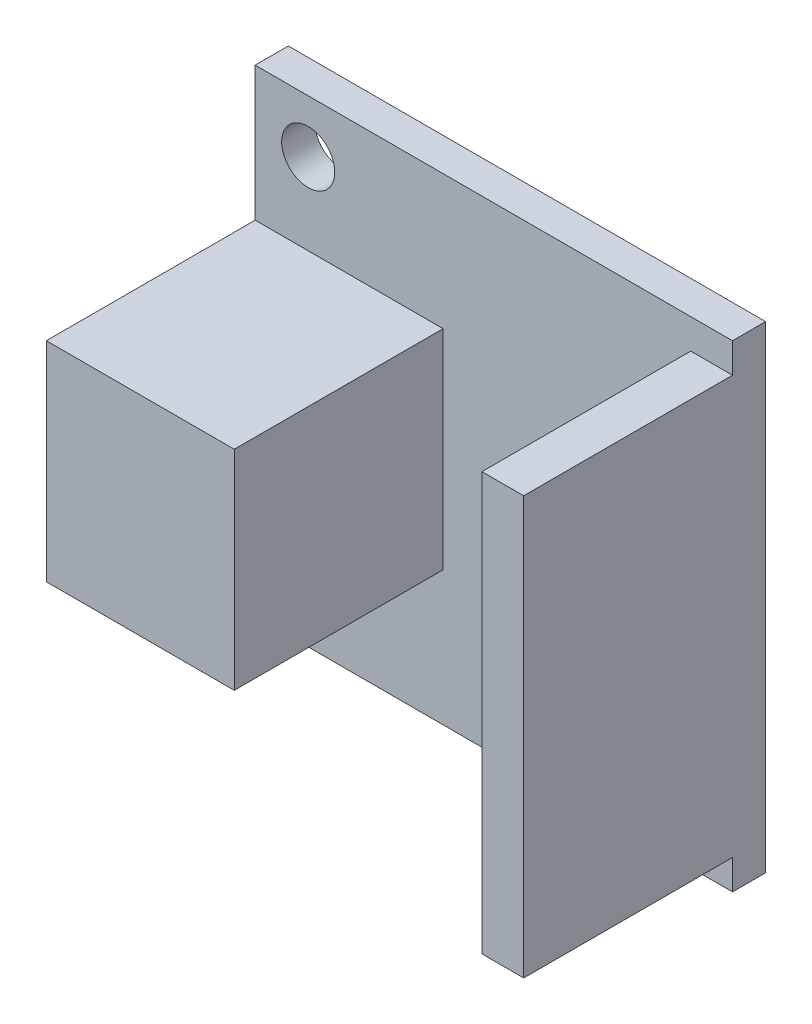
ISO-10303-21;
HEADER;
FILE_DESCRIPTION(('STEP AP214'),'2;1');
FILE_NAME('part.step','',(''),(''),'','','');
FILE_SCHEMA(('AUTOMOTIVE_DESIGN { 1 0 10303 214 1 1 1 1 }'));
ENDSEC;
DATA;
#1=APPLICATION_CONTEXT('core data for automotive mechanical design processes');
#2=APPLICATION_PROTOCOL_DEFINITION('international standard','automotive_design',2000,#1);
#3=PRODUCT_CONTEXT('',#1,'mechanical');
#4=PRODUCT('Part','Part','',(#3));
#5=PRODUCT_RELATED_PRODUCT_CATEGORY('part','',(#4));
#6=PRODUCT_DEFINITION_FORMATION('','',#4);
#7=PRODUCT_DEFINITION_CONTEXT('part definition',#1,'design');
#8=PRODUCT_DEFINITION('design','',#6,#7);
#9=PRODUCT_DEFINITION_SHAPE('','',#8);
#10=(LENGTH_UNIT() NAMED_UNIT(*) SI_UNIT(.MILLI.,.METRE.));
#11=(NAMED_UNIT(*) PLANE_ANGLE_UNIT() SI_UNIT($,.RADIAN.));
#12=(NAMED_UNIT(*) SI_UNIT($,.STERADIAN.) SOLID_ANGLE_UNIT());
#13=UNCERTAINTY_MEASURE_WITH_UNIT(LENGTH_MEASURE(1.E-05),#10,'distance_accuracy_value','');
#14=(GEOMETRIC_REPRESENTATION_CONTEXT(3) GLOBAL_UNCERTAINTY_ASSIGNED_CONTEXT((#13)) GLOBAL_UNIT_ASSIGNED_CONTEXT((#10,
#11,#12)) REPRESENTATION_CONTEXT('',''));
#15=CARTESIAN_POINT('',(0.,0.,0.));
#16=DIRECTION('',(0.,0.,1.));
#17=DIRECTION('',(1.,0.,0.));
#18=AXIS2_PLACEMENT_3D('',#15,#16,#17);
#19=CARTESIAN_POINT('',(0.,0.,1.5875));
#20=DIRECTION('',(0.,0.,1.));
#21=DIRECTION('',(1.,0.,0.));
#22=AXIS2_PLACEMENT_3D('',#19,#20,#21);
#23=PLANE('',#22);
#24=CARTESIAN_POINT('',(-8.89,8.89,1.5875));
#25=DIRECTION('',(0.,0.,1.));
#26=DIRECTION('',(1.,0.,0.));
#27=AXIS2_PLACEMENT_3D('',#24,#25,#26);
#28=CIRCLE('',#27,1.27);
#29=CARTESIAN_POINT('',(-7.62,8.89,1.5875));
#30=VERTEX_POINT('',#29);
#31=EDGE_CURVE('E416',#30,#30,#28,.T.);
#32=ORIENTED_EDGE('',*,*,#31,.F.);
#33=EDGE_LOOP('',(#32));
#34=FACE_BOUND('',#33,.T.);
#35=CARTESIAN_POINT('',(-8.89,-8.89,1.5875));
#36=DIRECTION('',(0.,0.,1.));
#37=DIRECTION('',(1.,0.,0.));
#38=AXIS2_PLACEMENT_3D('',#35,#36,#37);
#39=CIRCLE('',#38,1.27);
#40=CARTESIAN_POINT('',(-7.62,-8.89,1.5875));
#41=VERTEX_POINT('',#40);
#42=EDGE_CURVE('E424',#41,#41,#39,.T.);
#43=ORIENTED_EDGE('',*,*,#42,.F.);
#44=EDGE_LOOP('',(#43));
#45=FACE_BOUND('',#44,.T.);
#46=DIRECTION('',(0.,-1.,0.));
#47=VECTOR('',#46,1.);
#48=CARTESIAN_POINT('',(9.43,10.,1.5875));
#49=LINE('',#48,#47);
#50=CARTESIAN_POINT('',(9.43,10.,1.5875));
#51=VERTEX_POINT('',#50);
#52=CARTESIAN_POINT('',(9.43000000000001,-10.,1.5875));
#53=VERTEX_POINT('',#52);
#54=EDGE_CURVE('E436',#51,#53,#49,.T.);
#55=ORIENTED_EDGE('',*,*,#54,.F.);
#56=DIRECTION('',(-1.,0.,0.));
#57=VECTOR('',#56,1.);
#58=CARTESIAN_POINT('',(9.43,10.,1.5875));
#59=LINE('',#58,#57);
#60=CARTESIAN_POINT('',(11.43,10.,1.5875));
#61=VERTEX_POINT('',#60);
#62=EDGE_CURVE('E258',#61,#51,#59,.T.);
#63=ORIENTED_EDGE('',*,*,#62,.F.);
#64=DIRECTION('',(0.,1.,0.));
#65=VECTOR('',#64,1.);
#66=CARTESIAN_POINT('',(11.43,11.43,1.5875));
#67=LINE('',#66,#65);
#68=CARTESIAN_POINT('',(11.43,11.43,1.5875));
#69=VERTEX_POINT('',#68);
#70=EDGE_CURVE('E154',#61,#69,#67,.T.);
#71=ORIENTED_EDGE('',*,*,#70,.T.);
#72=DIRECTION('',(-1.,0.,0.));
#73=VECTOR('',#72,1.);
#74=CARTESIAN_POINT('',(-11.43,11.43,1.5875));
#75=LINE('',#74,#73);
#76=CARTESIAN_POINT('',(-11.43,11.43,1.5875));
#77=VERTEX_POINT('',#76);
#78=EDGE_CURVE('E204',#69,#77,#75,.T.);
#79=ORIENTED_EDGE('',*,*,#78,.T.);
#80=DIRECTION('',(0.,-1.,0.));
#81=VECTOR('',#80,1.);
#82=CARTESIAN_POINT('',(-11.43,11.43,1.5875));
#83=LINE('',#82,#81);
#84=CARTESIAN_POINT('',(-11.43,5.,1.5875));
#85=VERTEX_POINT('',#84);
#86=EDGE_CURVE('E208',#77,#85,#83,.T.);
#87=ORIENTED_EDGE('',*,*,#86,.T.);
#88=DIRECTION('',(-1.,0.,0.));
#89=VECTOR('',#88,1.);
#90=CARTESIAN_POINT('',(-11.43,5.,1.5875));
#91=LINE('',#90,#89);
#92=CARTESIAN_POINT('',(-2.43,5.,1.5875));
#93=VERTEX_POINT('',#92);
#94=EDGE_CURVE('E159',#93,#85,#91,.T.);
#95=ORIENTED_EDGE('',*,*,#94,.F.);
#96=DIRECTION('',(0.,1.,0.));
#97=VECTOR('',#96,1.);
#98=CARTESIAN_POINT('',(-2.43,5.,1.5875));
#99=LINE('',#98,#97);
#100=CARTESIAN_POINT('',(-2.43,-5.,1.5875));
#101=VERTEX_POINT('',#100);
#102=EDGE_CURVE('E62',#101,#93,#99,.T.);
#103=ORIENTED_EDGE('',*,*,#102,.F.);
#104=DIRECTION('',(1.,0.,0.));
#105=VECTOR('',#104,1.);
#106=CARTESIAN_POINT('',(-11.43,-5.,1.5875));
#107=LINE('',#106,#105);
#108=CARTESIAN_POINT('',(-11.43,-5.,1.5875));
#109=VERTEX_POINT('',#108);
#110=EDGE_CURVE('E169',#109,#101,#107,.T.);
#111=ORIENTED_EDGE('',*,*,#110,.F.);
#112=CARTESIAN_POINT('',(-11.43,-11.43,1.5875));
#113=VERTEX_POINT('',#112);
#114=EDGE_CURVE('E207',#109,#113,#83,.T.);
#115=ORIENTED_EDGE('',*,*,#114,.T.);
#116=DIRECTION('',(1.,0.,0.));
#117=VECTOR('',#116,1.);
#118=CARTESIAN_POINT('',(-11.43,-11.43,1.5875));
#119=LINE('',#118,#117);
#120=CARTESIAN_POINT('',(11.43,-11.43,1.5875));
#121=VERTEX_POINT('',#120);
#122=EDGE_CURVE('E211',#113,#121,#119,.T.);
#123=ORIENTED_EDGE('',*,*,#122,.T.);
#124=CARTESIAN_POINT('',(11.43,-10.,1.5875));
#125=VERTEX_POINT('',#124);
#126=EDGE_CURVE('E200',#121,#125,#67,.T.);
#127=ORIENTED_EDGE('',*,*,#126,.T.);
#128=DIRECTION('',(1.,0.,0.));
#129=VECTOR('',#128,1.);
#130=CARTESIAN_POINT('',(9.43000000000001,-10.,1.5875));
#131=LINE('',#130,#129);
#132=EDGE_CURVE('E149',#53,#125,#131,.T.);
#133=ORIENTED_EDGE('',*,*,#132,.F.);
#134=EDGE_LOOP('',(#55,#63,#71,#79,#87,#95,#103,#111,#115,#123,#127,#133));
#135=FACE_BOUND('',#134,.T.);
#136=ADVANCED_FACE('F38',(#34,#45,#135),#23,.T.);
#137=CARTESIAN_POINT('',(11.43,11.43,1.5875));
#138=DIRECTION('',(-1.,0.,0.));
#139=DIRECTION('',(0.,-1.,0.));
#140=AXIS2_PLACEMENT_3D('',#137,#138,#139);
#141=PLANE('',#140);
#142=DIRECTION('',(0.,1.,0.));
#143=VECTOR('',#142,1.);
#144=CARTESIAN_POINT('',(11.43,11.43,0.));
#145=LINE('',#144,#143);
#146=CARTESIAN_POINT('',(11.43,-11.43,0.));
#147=VERTEX_POINT('',#146);
#148=CARTESIAN_POINT('',(11.43,11.43,0.));
#149=VERTEX_POINT('',#148);
#150=EDGE_CURVE('E199',#147,#149,#145,.T.);
#151=ORIENTED_EDGE('',*,*,#150,.T.);
#152=DIRECTION('',(0.,0.,-1.));
#153=VECTOR('',#152,1.);
#154=CARTESIAN_POINT('',(11.43,11.43,1.5875));
#155=LINE('',#154,#153);
#156=EDGE_CURVE('E11',#69,#149,#155,.T.);
#157=ORIENTED_EDGE('',*,*,#156,.F.);
#158=ORIENTED_EDGE('',*,*,#70,.F.);
#159=DIRECTION('',(0.,0.,-1.));
#160=VECTOR('',#159,1.);
#161=CARTESIAN_POINT('',(11.43,10.,11.5875));
#162=LINE('',#161,#160);
#163=CARTESIAN_POINT('',(11.43,10.,11.5875));
#164=VERTEX_POINT('',#163);
#165=EDGE_CURVE('E132',#164,#61,#162,.T.);
#166=ORIENTED_EDGE('',*,*,#165,.F.);
#167=DIRECTION('',(0.,1.,0.));
#168=VECTOR('',#167,1.);
#169=CARTESIAN_POINT('',(11.43,10.,11.5875));
#170=LINE('',#169,#168);
#171=CARTESIAN_POINT('',(11.43,-10.,11.5875));
#172=VERTEX_POINT('',#171);
#173=EDGE_CURVE('E140',#172,#164,#170,.T.);
#174=ORIENTED_EDGE('',*,*,#173,.F.);
#175=DIRECTION('',(0.,0.,-1.));
#176=VECTOR('',#175,1.);
#177=CARTESIAN_POINT('',(11.43,-10.,11.5875));
#178=LINE('',#177,#176);
#179=EDGE_CURVE('E251',#172,#125,#178,.T.);
#180=ORIENTED_EDGE('',*,*,#179,.T.);
#181=ORIENTED_EDGE('',*,*,#126,.F.);
#182=DIRECTION('',(0.,0.,-1.));
#183=VECTOR('',#182,1.);
#184=CARTESIAN_POINT('',(11.43,-11.43,1.5875));
#185=LINE('',#184,#183);
#186=EDGE_CURVE('E214',#121,#147,#185,.T.);
#187=ORIENTED_EDGE('',*,*,#186,.T.);
#188=EDGE_LOOP('',(#151,#157,#158,#166,#174,#180,#181,#187));
#189=FACE_BOUND('',#188,.T.);
#190=ADVANCED_FACE('F40',(#189),#141,.F.);
#191=CARTESIAN_POINT('',(-11.43,11.43,1.5875));
#192=DIRECTION('',(0.,-1.,0.));
#193=DIRECTION('',(0.,0.,-1.));
#194=AXIS2_PLACEMENT_3D('',#191,#192,#193);
#195=PLANE('',#194);
#196=DIRECTION('',(-1.,0.,0.));
#197=VECTOR('',#196,1.);
#198=CARTESIAN_POINT('',(-11.43,11.43,0.));
#199=LINE('',#198,#197);
#200=CARTESIAN_POINT('',(-11.43,11.43,0.));
#201=VERTEX_POINT('',#200);
#202=EDGE_CURVE('E217',#149,#201,#199,.T.);
#203=ORIENTED_EDGE('',*,*,#202,.T.);
#204=DIRECTION('',(0.,0.,-1.));
#205=VECTOR('',#204,1.);
#206=CARTESIAN_POINT('',(-11.43,11.43,1.5875));
#207=LINE('',#206,#205);
#208=EDGE_CURVE('E47',#77,#201,#207,.T.);
#209=ORIENTED_EDGE('',*,*,#208,.F.);
#210=ORIENTED_EDGE('',*,*,#78,.F.);
#211=ORIENTED_EDGE('',*,*,#156,.T.);
#212=EDGE_LOOP('',(#203,#209,#210,#211));
#213=FACE_BOUND('',#212,.T.);
#214=ADVANCED_FACE('F259',(#213),#195,.F.);
#215=CARTESIAN_POINT('',(-11.43,11.43,1.5875));
#216=DIRECTION('',(1.,0.,0.));
#217=DIRECTION('',(0.,1.,0.));
#218=AXIS2_PLACEMENT_3D('',#215,#216,#217);
#219=PLANE('',#218);
#220=DIRECTION('',(0.,-1.,0.));
#221=VECTOR('',#220,1.);
#222=CARTESIAN_POINT('',(-11.43,11.43,0.));
#223=LINE('',#222,#221);
#224=CARTESIAN_POINT('',(-11.43,-11.43,0.));
#225=VERTEX_POINT('',#224);
#226=EDGE_CURVE('E220',#201,#225,#223,.T.);
#227=ORIENTED_EDGE('',*,*,#226,.T.);
#228=DIRECTION('',(0.,0.,-1.));
#229=VECTOR('',#228,1.);
#230=CARTESIAN_POINT('',(-11.43,-11.43,1.5875));
#231=LINE('',#230,#229);
#232=EDGE_CURVE('E229',#113,#225,#231,.T.);
#233=ORIENTED_EDGE('',*,*,#232,.F.);
#234=ORIENTED_EDGE('',*,*,#114,.F.);
#235=DIRECTION('',(0.,0.,-1.));
#236=VECTOR('',#235,1.);
#237=CARTESIAN_POINT('',(-11.43,-5.,11.5875));
#238=LINE('',#237,#236);
#239=CARTESIAN_POINT('',(-11.43,-5.,11.5875));
#240=VERTEX_POINT('',#239);
#241=EDGE_CURVE('E187',#240,#109,#238,.T.);
#242=ORIENTED_EDGE('',*,*,#241,.F.);
#243=DIRECTION('',(0.,-1.,0.));
#244=VECTOR('',#243,1.);
#245=CARTESIAN_POINT('',(-11.43,5.,11.5875));
#246=LINE('',#245,#244);
#247=CARTESIAN_POINT('',(-11.43,5.,11.5875));
#248=VERTEX_POINT('',#247);
#249=EDGE_CURVE('E172',#248,#240,#246,.T.);
#250=ORIENTED_EDGE('',*,*,#249,.F.);
#251=DIRECTION('',(0.,0.,-1.));
#252=VECTOR('',#251,1.);
#253=CARTESIAN_POINT('',(-11.43,5.,11.5875));
#254=LINE('',#253,#252);
#255=EDGE_CURVE('E191',#248,#85,#254,.T.);
#256=ORIENTED_EDGE('',*,*,#255,.T.);
#257=ORIENTED_EDGE('',*,*,#86,.F.);
#258=ORIENTED_EDGE('',*,*,#208,.T.);
#259=EDGE_LOOP('',(#227,#233,#234,#242,#250,#256,#257,#258));
#260=FACE_BOUND('',#259,.T.);
#261=ADVANCED_FACE('F238',(#260),#219,.F.);
#262=CARTESIAN_POINT('',(-11.43,-11.43,1.5875));
#263=DIRECTION('',(0.,1.,0.));
#264=DIRECTION('',(0.,0.,1.));
#265=AXIS2_PLACEMENT_3D('',#262,#263,#264);
#266=PLANE('',#265);
#267=DIRECTION('',(1.,0.,0.));
#268=VECTOR('',#267,1.);
#269=CARTESIAN_POINT('',(-11.43,-11.43,0.));
#270=LINE('',#269,#268);
#271=EDGE_CURVE('E223',#225,#147,#270,.T.);
#272=ORIENTED_EDGE('',*,*,#271,.T.);
#273=ORIENTED_EDGE('',*,*,#186,.F.);
#274=ORIENTED_EDGE('',*,*,#122,.F.);
#275=ORIENTED_EDGE('',*,*,#232,.T.);
#276=EDGE_LOOP('',(#272,#273,#274,#275));
#277=FACE_BOUND('',#276,.T.);
#278=ADVANCED_FACE('F248',(#277),#266,.F.);
#279=CARTESIAN_POINT('',(0.,0.,0.));
#280=DIRECTION('',(0.,0.,1.));
#281=DIRECTION('',(1.,0.,0.));
#282=AXIS2_PLACEMENT_3D('',#279,#280,#281);
#283=PLANE('',#282);
#284=CARTESIAN_POINT('',(-8.89,8.89,0.));
#285=DIRECTION('',(0.,0.,1.));
#286=DIRECTION('',(1.,0.,0.));
#287=AXIS2_PLACEMENT_3D('',#284,#285,#286);
#288=CIRCLE('',#287,1.27);
#289=CARTESIAN_POINT('',(-7.62,8.89,0.));
#290=VERTEX_POINT('',#289);
#291=EDGE_CURVE('E414',#290,#290,#288,.T.);
#292=ORIENTED_EDGE('',*,*,#291,.T.);
#293=EDGE_LOOP('',(#292));
#294=FACE_BOUND('',#293,.T.);
#295=CARTESIAN_POINT('',(-8.89,-8.89,0.));
#296=DIRECTION('',(0.,0.,1.));
#297=DIRECTION('',(1.,0.,0.));
#298=AXIS2_PLACEMENT_3D('',#295,#296,#297);
#299=CIRCLE('',#298,1.27);
#300=CARTESIAN_POINT('',(-7.62,-8.89,0.));
#301=VERTEX_POINT('',#300);
#302=EDGE_CURVE('E418',#301,#301,#299,.T.);
#303=ORIENTED_EDGE('',*,*,#302,.T.);
#304=EDGE_LOOP('',(#303));
#305=FACE_BOUND('',#304,.T.);
#306=ORIENTED_EDGE('',*,*,#150,.F.);
#307=ORIENTED_EDGE('',*,*,#271,.F.);
#308=ORIENTED_EDGE('',*,*,#226,.F.);
#309=ORIENTED_EDGE('',*,*,#202,.F.);
#310=EDGE_LOOP('',(#306,#307,#308,#309));
#311=FACE_BOUND('',#310,.T.);
#312=ADVANCED_FACE('F245',(#294,#305,#311),#283,.F.);
#313=CARTESIAN_POINT('',(-2.43,5.,11.5875));
#314=DIRECTION('',(-1.,0.,0.));
#315=DIRECTION('',(0.,0.,1.));
#316=AXIS2_PLACEMENT_3D('',#313,#314,#315);
#317=PLANE('',#316);
#318=ORIENTED_EDGE('',*,*,#102,.T.);
#319=DIRECTION('',(0.,0.,-1.));
#320=VECTOR('',#319,1.);
#321=CARTESIAN_POINT('',(-2.43,5.,11.5875));
#322=LINE('',#321,#320);
#323=CARTESIAN_POINT('',(-2.43,5.,11.5875));
#324=VERTEX_POINT('',#323);
#325=EDGE_CURVE('E195',#324,#93,#322,.T.);
#326=ORIENTED_EDGE('',*,*,#325,.F.);
#327=DIRECTION('',(0.,1.,0.));
#328=VECTOR('',#327,1.);
#329=CARTESIAN_POINT('',(-2.43,5.,11.5875));
#330=LINE('',#329,#328);
#331=CARTESIAN_POINT('',(-2.43,-5.,11.5875));
#332=VERTEX_POINT('',#331);
#333=EDGE_CURVE('E164',#332,#324,#330,.T.);
#334=ORIENTED_EDGE('',*,*,#333,.F.);
#335=DIRECTION('',(0.,0.,-1.));
#336=VECTOR('',#335,1.);
#337=CARTESIAN_POINT('',(-2.43,-5.,11.5875));
#338=LINE('',#337,#336);
#339=EDGE_CURVE('E177',#332,#101,#338,.T.);
#340=ORIENTED_EDGE('',*,*,#339,.T.);
#341=EDGE_LOOP('',(#318,#326,#334,#340));
#342=FACE_BOUND('',#341,.T.);
#343=ADVANCED_FACE('F277',(#342),#317,.F.);
#344=CARTESIAN_POINT('',(-11.43,5.,11.5875));
#345=DIRECTION('',(0.,-1.,0.));
#346=DIRECTION('',(0.,0.,-1.));
#347=AXIS2_PLACEMENT_3D('',#344,#345,#346);
#348=PLANE('',#347);
#349=ORIENTED_EDGE('',*,*,#94,.T.);
#350=ORIENTED_EDGE('',*,*,#255,.F.);
#351=DIRECTION('',(-1.,0.,0.));
#352=VECTOR('',#351,1.);
#353=CARTESIAN_POINT('',(-11.43,5.,11.5875));
#354=LINE('',#353,#352);
#355=EDGE_CURVE('E168',#324,#248,#354,.T.);
#356=ORIENTED_EDGE('',*,*,#355,.F.);
#357=ORIENTED_EDGE('',*,*,#325,.T.);
#358=EDGE_LOOP('',(#349,#350,#356,#357));
#359=FACE_BOUND('',#358,.T.);
#360=ADVANCED_FACE('F300',(#359),#348,.F.);
#361=CARTESIAN_POINT('',(-11.43,-5.,11.5875));
#362=DIRECTION('',(0.,1.,0.));
#363=DIRECTION('',(0.,0.,1.));
#364=AXIS2_PLACEMENT_3D('',#361,#362,#363);
#365=PLANE('',#364);
#366=ORIENTED_EDGE('',*,*,#110,.T.);
#367=ORIENTED_EDGE('',*,*,#339,.F.);
#368=DIRECTION('',(1.,0.,0.));
#369=VECTOR('',#368,1.);
#370=CARTESIAN_POINT('',(-11.43,-5.,11.5875));
#371=LINE('',#370,#369);
#372=EDGE_CURVE('E175',#240,#332,#371,.T.);
#373=ORIENTED_EDGE('',*,*,#372,.F.);
#374=ORIENTED_EDGE('',*,*,#241,.T.);
#375=EDGE_LOOP('',(#366,#367,#373,#374));
#376=FACE_BOUND('',#375,.T.);
#377=ADVANCED_FACE('F307',(#376),#365,.F.);
#378=CARTESIAN_POINT('',(0.,0.,11.5875));
#379=DIRECTION('',(0.,0.,1.));
#380=DIRECTION('',(1.,0.,0.));
#381=AXIS2_PLACEMENT_3D('',#378,#379,#380);
#382=PLANE('',#381);
#383=ORIENTED_EDGE('',*,*,#333,.T.);
#384=ORIENTED_EDGE('',*,*,#355,.T.);
#385=ORIENTED_EDGE('',*,*,#249,.T.);
#386=ORIENTED_EDGE('',*,*,#372,.T.);
#387=EDGE_LOOP('',(#383,#384,#385,#386));
#388=FACE_BOUND('',#387,.T.);
#389=ADVANCED_FACE('F314',(#388),#382,.T.);
#390=CARTESIAN_POINT('',(9.43,10.,11.5875));
#391=DIRECTION('',(0.,-1.,0.));
#392=DIRECTION('',(0.,0.,-1.));
#393=AXIS2_PLACEMENT_3D('',#390,#391,#392);
#394=PLANE('',#393);
#395=ORIENTED_EDGE('',*,*,#62,.T.);
#396=DIRECTION('',(0.,0.,-1.));
#397=VECTOR('',#396,1.);
#398=CARTESIAN_POINT('',(9.43,10.,11.5875));
#399=LINE('',#398,#397);
#400=CARTESIAN_POINT('',(9.43,10.,11.5875));
#401=VERTEX_POINT('',#400);
#402=EDGE_CURVE('E135',#401,#51,#399,.T.);
#403=ORIENTED_EDGE('',*,*,#402,.F.);
#404=DIRECTION('',(-1.,0.,0.));
#405=VECTOR('',#404,1.);
#406=CARTESIAN_POINT('',(9.43,10.,11.5875));
#407=LINE('',#406,#405);
#408=EDGE_CURVE('E128',#164,#401,#407,.T.);
#409=ORIENTED_EDGE('',*,*,#408,.F.);
#410=ORIENTED_EDGE('',*,*,#165,.T.);
#411=EDGE_LOOP('',(#395,#403,#409,#410));
#412=FACE_BOUND('',#411,.T.);
#413=ADVANCED_FACE('F130',(#412),#394,.F.);
#414=CARTESIAN_POINT('',(9.43,10.,11.5875));
#415=DIRECTION('',(1.,0.,0.));
#416=DIRECTION('',(0.,1.,0.));
#417=AXIS2_PLACEMENT_3D('',#414,#415,#416);
#418=PLANE('',#417);
#419=ORIENTED_EDGE('',*,*,#54,.T.);
#420=DIRECTION('',(0.,0.,-1.));
#421=VECTOR('',#420,1.);
#422=CARTESIAN_POINT('',(9.43000000000001,-10.,11.5875));
#423=LINE('',#422,#421);
#424=CARTESIAN_POINT('',(9.43000000000001,-10.,11.5875));
#425=VERTEX_POINT('',#424);
#426=EDGE_CURVE('E54',#425,#53,#423,.T.);
#427=ORIENTED_EDGE('',*,*,#426,.F.);
#428=DIRECTION('',(0.,-1.,0.));
#429=VECTOR('',#428,1.);
#430=CARTESIAN_POINT('',(9.43,10.,11.5875));
#431=LINE('',#430,#429);
#432=EDGE_CURVE('E139',#401,#425,#431,.T.);
#433=ORIENTED_EDGE('',*,*,#432,.F.);
#434=ORIENTED_EDGE('',*,*,#402,.T.);
#435=EDGE_LOOP('',(#419,#427,#433,#434));
#436=FACE_BOUND('',#435,.T.);
#437=ADVANCED_FACE('F330',(#436),#418,.F.);
#438=CARTESIAN_POINT('',(9.43000000000001,-10.,11.5875));
#439=DIRECTION('',(0.,1.,0.));
#440=DIRECTION('',(0.,0.,1.));
#441=AXIS2_PLACEMENT_3D('',#438,#439,#440);
#442=PLANE('',#441);
#443=ORIENTED_EDGE('',*,*,#132,.T.);
#444=ORIENTED_EDGE('',*,*,#179,.F.);
#445=DIRECTION('',(1.,0.,0.));
#446=VECTOR('',#445,1.);
#447=CARTESIAN_POINT('',(9.43000000000001,-10.,11.5875));
#448=LINE('',#447,#446);
#449=EDGE_CURVE('E144',#425,#172,#448,.T.);
#450=ORIENTED_EDGE('',*,*,#449,.F.);
#451=ORIENTED_EDGE('',*,*,#426,.T.);
#452=EDGE_LOOP('',(#443,#444,#450,#451));
#453=FACE_BOUND('',#452,.T.);
#454=ADVANCED_FACE('F337',(#453),#442,.F.);
#455=CARTESIAN_POINT('',(0.,0.,11.5875));
#456=DIRECTION('',(0.,0.,1.));
#457=DIRECTION('',(1.,0.,0.));
#458=AXIS2_PLACEMENT_3D('',#455,#456,#457);
#459=PLANE('',#458);
#460=ORIENTED_EDGE('',*,*,#173,.T.);
#461=ORIENTED_EDGE('',*,*,#408,.T.);
#462=ORIENTED_EDGE('',*,*,#432,.T.);
#463=ORIENTED_EDGE('',*,*,#449,.T.);
#464=EDGE_LOOP('',(#460,#461,#462,#463));
#465=FACE_BOUND('',#464,.T.);
#466=ADVANCED_FACE('F143',(#465),#459,.T.);
#467=CARTESIAN_POINT('',(-8.89,-8.89,0.));
#468=DIRECTION('',(0.,0.,1.));
#469=DIRECTION('',(1.,0.,0.));
#470=AXIS2_PLACEMENT_3D('',#467,#468,#469);
#471=CYLINDRICAL_SURFACE('',#470,1.27);
#472=ORIENTED_EDGE('',*,*,#302,.F.);
#473=EDGE_LOOP('',(#472));
#474=FACE_BOUND('',#473,.T.);
#475=ORIENTED_EDGE('',*,*,#42,.T.);
#476=EDGE_LOOP('',(#475));
#477=FACE_BOUND('',#476,.T.);
#478=ADVANCED_FACE('F350',(#474,#477),#471,.F.);
#479=CARTESIAN_POINT('',(-8.89,8.89,0.));
#480=DIRECTION('',(0.,0.,1.));
#481=DIRECTION('',(1.,0.,0.));
#482=AXIS2_PLACEMENT_3D('',#479,#480,#481);
#483=CYLINDRICAL_SURFACE('',#482,1.27);
#484=ORIENTED_EDGE('',*,*,#291,.F.);
#485=EDGE_LOOP('',(#484));
#486=FACE_BOUND('',#485,.T.);
#487=ORIENTED_EDGE('',*,*,#31,.T.);
#488=EDGE_LOOP('',(#487));
#489=FACE_BOUND('',#488,.T.);
#490=ADVANCED_FACE('F356',(#486,#489),#483,.F.);
#491=CLOSED_SHELL('',(#136,#190,#214,#261,#278,#312,#343,#360,#377,#389,#413,#437,#454,#466,
#478,#490));
#492=MANIFOLD_SOLID_BREP('B2',#491);
#493=ADVANCED_BREP_SHAPE_REPRESENTATION('',(#18,#492),#14);
#494=SHAPE_DEFINITION_REPRESENTATION(#9,#493);
ENDSEC;
END-ISO-10303-21;
